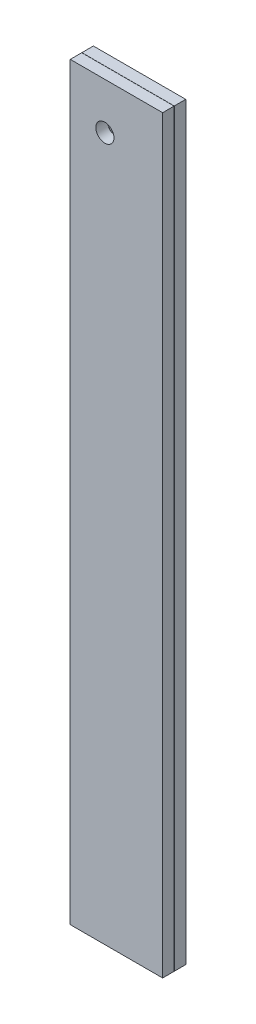
ISO-10303-21;
HEADER;
FILE_DESCRIPTION(('STEP AP214'),'2;1');
FILE_NAME('part.step','',(''),(''),'','','');
FILE_SCHEMA(('AUTOMOTIVE_DESIGN { 1 0 10303 214 1 1 1 1 }'));
ENDSEC;
DATA;
#1=APPLICATION_CONTEXT('core data for automotive mechanical design processes');
#2=APPLICATION_PROTOCOL_DEFINITION('international standard','automotive_design',2000,#1);
#3=PRODUCT_CONTEXT('',#1,'mechanical');
#4=PRODUCT('Part','Part','',(#3));
#5=PRODUCT_RELATED_PRODUCT_CATEGORY('part','',(#4));
#6=PRODUCT_DEFINITION_FORMATION('','',#4);
#7=PRODUCT_DEFINITION_CONTEXT('part definition',#1,'design');
#8=PRODUCT_DEFINITION('design','',#6,#7);
#9=PRODUCT_DEFINITION_SHAPE('','',#8);
#10=(LENGTH_UNIT() NAMED_UNIT(*) SI_UNIT(.MILLI.,.METRE.));
#11=(NAMED_UNIT(*) PLANE_ANGLE_UNIT() SI_UNIT($,.RADIAN.));
#12=(NAMED_UNIT(*) SI_UNIT($,.STERADIAN.) SOLID_ANGLE_UNIT());
#13=UNCERTAINTY_MEASURE_WITH_UNIT(LENGTH_MEASURE(1.E-05),#10,'distance_accuracy_value','');
#14=(GEOMETRIC_REPRESENTATION_CONTEXT(3) GLOBAL_UNCERTAINTY_ASSIGNED_CONTEXT((#13)) GLOBAL_UNIT_ASSIGNED_CONTEXT((#10,
#11,#12)) REPRESENTATION_CONTEXT('',''));
#15=CARTESIAN_POINT('',(0.,0.,0.));
#16=DIRECTION('',(0.,0.,1.));
#17=DIRECTION('',(1.,0.,0.));
#18=AXIS2_PLACEMENT_3D('',#15,#16,#17);
#19=CARTESIAN_POINT('',(0.,0.,6.41));
#20=DIRECTION('',(0.,0.,1.));
#21=DIRECTION('',(0.,-1.,0.));
#22=AXIS2_PLACEMENT_3D('',#19,#20,#21);
#23=PLANE('',#22);
#24=CARTESIAN_POINT('',(19.0400000000212,-25.3999999999761,6.41));
#25=DIRECTION('',(0.,0.,1.));
#26=DIRECTION('',(0.,-1.,0.));
#27=AXIS2_PLACEMENT_3D('',#24,#25,#26);
#28=CIRCLE('',#27,5.);
#29=CARTESIAN_POINT('',(19.0400000000212,-30.3999999999761,6.40999999999999));
#30=VERTEX_POINT('',#29);
#31=EDGE_CURVE('E111',#30,#30,#28,.T.);
#32=ORIENTED_EDGE('',*,*,#31,.T.);
#33=EDGE_LOOP('',(#32));
#34=FACE_BOUND('',#33,.T.);
#35=DIRECTION('',(0.,-1.,0.));
#36=VECTOR('',#35,1.);
#37=CARTESIAN_POINT('',(50.7999999999999,0.,6.41));
#38=LINE('',#37,#36);
#39=CARTESIAN_POINT('',(50.7999999999999,0.,6.41));
#40=VERTEX_POINT('',#39);
#41=CARTESIAN_POINT('',(50.8,-412.09566061,6.40999999999995));
#42=VERTEX_POINT('',#41);
#43=EDGE_CURVE('E108',#40,#42,#38,.T.);
#44=ORIENTED_EDGE('',*,*,#43,.T.);
#45=DIRECTION('',(1.,0.,0.));
#46=VECTOR('',#45,1.);
#47=CARTESIAN_POINT('',(0.,-412.09566061,6.40999999999995));
#48=LINE('',#47,#46);
#49=CARTESIAN_POINT('',(0.,-412.09566061,6.40999999999995));
#50=VERTEX_POINT('',#49);
#51=EDGE_CURVE('E12',#50,#42,#48,.T.);
#52=ORIENTED_EDGE('',*,*,#51,.F.);
#53=DIRECTION('',(0.,-1.,0.));
#54=VECTOR('',#53,1.);
#55=CARTESIAN_POINT('',(0.,0.,6.41));
#56=LINE('',#55,#54);
#57=CARTESIAN_POINT('',(0.,0.,6.41));
#58=VERTEX_POINT('',#57);
#59=EDGE_CURVE('E62',#58,#50,#56,.T.);
#60=ORIENTED_EDGE('',*,*,#59,.F.);
#61=DIRECTION('',(1.,0.,0.));
#62=VECTOR('',#61,1.);
#63=CARTESIAN_POINT('',(0.,0.,6.41));
#64=LINE('',#63,#62);
#65=EDGE_CURVE('E47',#58,#40,#64,.T.);
#66=ORIENTED_EDGE('',*,*,#65,.T.);
#67=EDGE_LOOP('',(#44,#52,#60,#66));
#68=FACE_BOUND('',#67,.T.);
#69=ADVANCED_FACE('F44',(#34,#68),#23,.F.);
#70=CARTESIAN_POINT('',(0.,-412.09566061,0.));
#71=DIRECTION('',(0.,-1.,0.));
#72=DIRECTION('',(1.,0.,0.));
#73=AXIS2_PLACEMENT_3D('',#70,#71,#72);
#74=PLANE('',#73);
#75=DIRECTION('',(0.,0.,-1.));
#76=VECTOR('',#75,1.);
#77=CARTESIAN_POINT('',(50.8,-412.09566061,0.));
#78=LINE('',#77,#76);
#79=CARTESIAN_POINT('',(50.8,-412.09566061,12.7199999999999));
#80=VERTEX_POINT('',#79);
#81=EDGE_CURVE('E103',#80,#42,#78,.T.);
#82=ORIENTED_EDGE('',*,*,#81,.F.);
#83=DIRECTION('',(1.,0.,0.));
#84=VECTOR('',#83,1.);
#85=CARTESIAN_POINT('',(0.,-412.09566061,12.7199999999999));
#86=LINE('',#85,#84);
#87=CARTESIAN_POINT('',(0.,-412.09566061,12.7199999999999));
#88=VERTEX_POINT('',#87);
#89=EDGE_CURVE('E53',#88,#80,#86,.T.);
#90=ORIENTED_EDGE('',*,*,#89,.F.);
#91=DIRECTION('',(0.,0.,-1.));
#92=VECTOR('',#91,1.);
#93=CARTESIAN_POINT('',(0.,-412.09566061,0.));
#94=LINE('',#93,#92);
#95=EDGE_CURVE('E99',#88,#50,#94,.T.);
#96=ORIENTED_EDGE('',*,*,#95,.T.);
#97=ORIENTED_EDGE('',*,*,#51,.T.);
#98=EDGE_LOOP('',(#82,#90,#96,#97));
#99=FACE_BOUND('',#98,.T.);
#100=ADVANCED_FACE('F119',(#99),#74,.T.);
#101=CARTESIAN_POINT('',(0.,0.,12.72));
#102=DIRECTION('',(0.,0.,1.));
#103=DIRECTION('',(0.,-1.,0.));
#104=AXIS2_PLACEMENT_3D('',#101,#102,#103);
#105=PLANE('',#104);
#106=CARTESIAN_POINT('',(19.0400000000212,-25.3999999999761,12.72));
#107=DIRECTION('',(0.,0.,1.));
#108=DIRECTION('',(1.,0.,0.));
#109=AXIS2_PLACEMENT_3D('',#106,#107,#108);
#110=CIRCLE('',#109,5.);
#111=CARTESIAN_POINT('',(24.0400000000212,-25.3999999999761,12.72));
#112=VERTEX_POINT('',#111);
#113=EDGE_CURVE('E147',#112,#112,#110,.T.);
#114=ORIENTED_EDGE('',*,*,#113,.F.);
#115=EDGE_LOOP('',(#114));
#116=FACE_BOUND('',#115,.T.);
#117=DIRECTION('',(0.,-1.,0.));
#118=VECTOR('',#117,1.);
#119=CARTESIAN_POINT('',(50.7999999999999,0.,12.72));
#120=LINE('',#119,#118);
#121=CARTESIAN_POINT('',(50.7999999999999,0.,12.72));
#122=VERTEX_POINT('',#121);
#123=EDGE_CURVE('E95',#122,#80,#120,.T.);
#124=ORIENTED_EDGE('',*,*,#123,.F.);
#125=DIRECTION('',(1.,0.,0.));
#126=VECTOR('',#125,1.);
#127=CARTESIAN_POINT('',(0.,0.,12.72));
#128=LINE('',#127,#126);
#129=CARTESIAN_POINT('',(0.,0.,12.72));
#130=VERTEX_POINT('',#129);
#131=EDGE_CURVE('E91',#130,#122,#128,.T.);
#132=ORIENTED_EDGE('',*,*,#131,.F.);
#133=DIRECTION('',(0.,-1.,0.));
#134=VECTOR('',#133,1.);
#135=CARTESIAN_POINT('',(0.,0.,12.72));
#136=LINE('',#135,#134);
#137=EDGE_CURVE('E94',#130,#88,#136,.T.);
#138=ORIENTED_EDGE('',*,*,#137,.T.);
#139=ORIENTED_EDGE('',*,*,#89,.T.);
#140=EDGE_LOOP('',(#124,#132,#138,#139));
#141=FACE_BOUND('',#140,.T.);
#142=ADVANCED_FACE('F93',(#116,#141),#105,.T.);
#143=CARTESIAN_POINT('',(0.,0.,0.));
#144=DIRECTION('',(0.,1.,0.));
#145=DIRECTION('',(-1.,0.,0.));
#146=AXIS2_PLACEMENT_3D('',#143,#144,#145);
#147=PLANE('',#146);
#148=DIRECTION('',(0.,0.,1.));
#149=VECTOR('',#148,1.);
#150=CARTESIAN_POINT('',(50.7999999999999,0.,0.));
#151=LINE('',#150,#149);
#152=EDGE_CURVE('E110',#40,#122,#151,.T.);
#153=ORIENTED_EDGE('',*,*,#152,.F.);
#154=ORIENTED_EDGE('',*,*,#65,.F.);
#155=DIRECTION('',(0.,0.,1.));
#156=VECTOR('',#155,1.);
#157=CARTESIAN_POINT('',(0.,0.,0.));
#158=LINE('',#157,#156);
#159=EDGE_CURVE('E98',#58,#130,#158,.T.);
#160=ORIENTED_EDGE('',*,*,#159,.T.);
#161=ORIENTED_EDGE('',*,*,#131,.T.);
#162=EDGE_LOOP('',(#153,#154,#160,#161));
#163=FACE_BOUND('',#162,.T.);
#164=ADVANCED_FACE('F101',(#163),#147,.T.);
#165=CARTESIAN_POINT('',(0.,0.,0.));
#166=DIRECTION('',(1.,0.,0.));
#167=DIRECTION('',(0.,1.,0.));
#168=AXIS2_PLACEMENT_3D('',#165,#166,#167);
#169=PLANE('',#168);
#170=ORIENTED_EDGE('',*,*,#59,.T.);
#171=ORIENTED_EDGE('',*,*,#95,.F.);
#172=ORIENTED_EDGE('',*,*,#137,.F.);
#173=ORIENTED_EDGE('',*,*,#159,.F.);
#174=EDGE_LOOP('',(#170,#171,#172,#173));
#175=FACE_BOUND('',#174,.T.);
#176=ADVANCED_FACE('F97',(#175),#169,.F.);
#177=CARTESIAN_POINT('',(50.7999999999999,0.,0.));
#178=DIRECTION('',(1.,0.,0.));
#179=DIRECTION('',(0.,1.,0.));
#180=AXIS2_PLACEMENT_3D('',#177,#178,#179);
#181=PLANE('',#180);
#182=ORIENTED_EDGE('',*,*,#43,.F.);
#183=ORIENTED_EDGE('',*,*,#152,.T.);
#184=ORIENTED_EDGE('',*,*,#123,.T.);
#185=ORIENTED_EDGE('',*,*,#81,.T.);
#186=EDGE_LOOP('',(#182,#183,#184,#185));
#187=FACE_BOUND('',#186,.T.);
#188=ADVANCED_FACE('F118',(#187),#181,.T.);
#189=CARTESIAN_POINT('',(19.0400000000212,-25.3999999999761,-18.28));
#190=DIRECTION('',(0.,0.,1.));
#191=DIRECTION('',(1.,0.,0.));
#192=AXIS2_PLACEMENT_3D('',#189,#190,#191);
#193=CYLINDRICAL_SURFACE('',#192,5.);
#194=ORIENTED_EDGE('',*,*,#113,.T.);
#195=EDGE_LOOP('',(#194));
#196=FACE_BOUND('',#195,.T.);
#197=ORIENTED_EDGE('',*,*,#31,.F.);
#198=EDGE_LOOP('',(#197));
#199=FACE_BOUND('',#198,.T.);
#200=ADVANCED_FACE('F138',(#196,#199),#193,.F.);
#201=CLOSED_SHELL('',(#69,#100,#142,#164,#176,#188,#200));
#202=MANIFOLD_SOLID_BREP('B2',#201);
#203=CARTESIAN_POINT('',(0.,-412.09566061,6.31));
#204=DIRECTION('',(1.,0.,0.));
#205=DIRECTION('',(0.,0.,-1.));
#206=AXIS2_PLACEMENT_3D('',#203,#204,#205);
#207=PLANE('',#206);
#208=DIRECTION('',(0.,-1.,0.));
#209=VECTOR('',#208,1.);
#210=CARTESIAN_POINT('',(0.,-412.09566061,0.));
#211=LINE('',#210,#209);
#212=CARTESIAN_POINT('',(0.,0.,0.));
#213=VERTEX_POINT('',#212);
#214=CARTESIAN_POINT('',(0.,-412.09566061,0.));
#215=VERTEX_POINT('',#214);
#216=EDGE_CURVE('E253',#213,#215,#211,.T.);
#217=ORIENTED_EDGE('',*,*,#216,.T.);
#218=DIRECTION('',(0.,0.,-1.));
#219=VECTOR('',#218,1.);
#220=CARTESIAN_POINT('',(0.,-412.09566061,6.31));
#221=LINE('',#220,#219);
#222=CARTESIAN_POINT('',(0.,-412.09566061,6.31));
#223=VERTEX_POINT('',#222);
#224=EDGE_CURVE('E42',#223,#215,#221,.T.);
#225=ORIENTED_EDGE('',*,*,#224,.F.);
#226=DIRECTION('',(0.,-1.,0.));
#227=VECTOR('',#226,1.);
#228=CARTESIAN_POINT('',(0.,-412.09566061,6.31));
#229=LINE('',#228,#227);
#230=CARTESIAN_POINT('',(0.,0.,6.31));
#231=VERTEX_POINT('',#230);
#232=EDGE_CURVE('E239',#231,#223,#229,.T.);
#233=ORIENTED_EDGE('',*,*,#232,.F.);
#234=DIRECTION('',(0.,0.,-1.));
#235=VECTOR('',#234,1.);
#236=CARTESIAN_POINT('',(0.,0.,6.31));
#237=LINE('',#236,#235);
#238=EDGE_CURVE('E249',#231,#213,#237,.T.);
#239=ORIENTED_EDGE('',*,*,#238,.T.);
#240=EDGE_LOOP('',(#217,#225,#233,#239));
#241=FACE_BOUND('',#240,.T.);
#242=ADVANCED_FACE('F188',(#241),#207,.F.);
#243=CARTESIAN_POINT('',(50.8,-412.09566061,6.31));
#244=DIRECTION('',(0.,1.,0.));
#245=DIRECTION('',(0.,0.,1.));
#246=AXIS2_PLACEMENT_3D('',#243,#244,#245);
#247=PLANE('',#246);
#248=DIRECTION('',(1.,0.,0.));
#249=VECTOR('',#248,1.);
#250=CARTESIAN_POINT('',(50.8,-412.09566061,0.));
#251=LINE('',#250,#249);
#252=CARTESIAN_POINT('',(50.8,-412.09566061,0.));
#253=VERTEX_POINT('',#252);
#254=EDGE_CURVE('E244',#215,#253,#251,.T.);
#255=ORIENTED_EDGE('',*,*,#254,.T.);
#256=DIRECTION('',(0.,0.,-1.));
#257=VECTOR('',#256,1.);
#258=CARTESIAN_POINT('',(50.8,-412.09566061,6.31));
#259=LINE('',#258,#257);
#260=CARTESIAN_POINT('',(50.8,-412.09566061,6.31));
#261=VERTEX_POINT('',#260);
#262=EDGE_CURVE('E197',#261,#253,#259,.T.);
#263=ORIENTED_EDGE('',*,*,#262,.F.);
#264=DIRECTION('',(1.,0.,0.));
#265=VECTOR('',#264,1.);
#266=CARTESIAN_POINT('',(50.8,-412.09566061,6.31));
#267=LINE('',#266,#265);
#268=EDGE_CURVE('E234',#223,#261,#267,.T.);
#269=ORIENTED_EDGE('',*,*,#268,.F.);
#270=ORIENTED_EDGE('',*,*,#224,.T.);
#271=EDGE_LOOP('',(#255,#263,#269,#270));
#272=FACE_BOUND('',#271,.T.);
#273=ADVANCED_FACE('F243',(#272),#247,.F.);
#274=CARTESIAN_POINT('',(50.7999999999999,0.,6.31));
#275=DIRECTION('',(-1.,0.,0.));
#276=DIRECTION('',(0.,-1.,0.));
#277=AXIS2_PLACEMENT_3D('',#274,#275,#276);
#278=PLANE('',#277);
#279=DIRECTION('',(0.,1.,0.));
#280=VECTOR('',#279,1.);
#281=CARTESIAN_POINT('',(50.7999999999999,0.,0.));
#282=LINE('',#281,#280);
#283=CARTESIAN_POINT('',(50.7999999999999,0.,0.));
#284=VERTEX_POINT('',#283);
#285=EDGE_CURVE('E221',#253,#284,#282,.T.);
#286=ORIENTED_EDGE('',*,*,#285,.T.);
#287=DIRECTION('',(0.,0.,-1.));
#288=VECTOR('',#287,1.);
#289=CARTESIAN_POINT('',(50.7999999999999,0.,6.31));
#290=LINE('',#289,#288);
#291=CARTESIAN_POINT('',(50.7999999999999,0.,6.31));
#292=VERTEX_POINT('',#291);
#293=EDGE_CURVE('E245',#292,#284,#290,.T.);
#294=ORIENTED_EDGE('',*,*,#293,.F.);
#295=DIRECTION('',(0.,1.,0.));
#296=VECTOR('',#295,1.);
#297=CARTESIAN_POINT('',(50.8,-361.29566061,6.31));
#298=LINE('',#297,#296);
#299=EDGE_CURVE('E237',#261,#292,#298,.T.);
#300=ORIENTED_EDGE('',*,*,#299,.F.);
#301=ORIENTED_EDGE('',*,*,#262,.T.);
#302=EDGE_LOOP('',(#286,#294,#300,#301));
#303=FACE_BOUND('',#302,.T.);
#304=ADVANCED_FACE('F247',(#303),#278,.F.);
#305=CARTESIAN_POINT('',(0.,0.,6.31));
#306=DIRECTION('',(0.,-1.,0.));
#307=DIRECTION('',(0.,0.,-1.));
#308=AXIS2_PLACEMENT_3D('',#305,#306,#307);
#309=PLANE('',#308);
#310=DIRECTION('',(-1.,0.,0.));
#311=VECTOR('',#310,1.);
#312=CARTESIAN_POINT('',(0.,0.,0.));
#313=LINE('',#312,#311);
#314=EDGE_CURVE('E227',#284,#213,#313,.T.);
#315=ORIENTED_EDGE('',*,*,#314,.T.);
#316=ORIENTED_EDGE('',*,*,#238,.F.);
#317=DIRECTION('',(-1.,0.,0.));
#318=VECTOR('',#317,1.);
#319=CARTESIAN_POINT('',(0.,0.,6.31));
#320=LINE('',#319,#318);
#321=EDGE_CURVE('E205',#292,#231,#320,.T.);
#322=ORIENTED_EDGE('',*,*,#321,.F.);
#323=ORIENTED_EDGE('',*,*,#293,.T.);
#324=EDGE_LOOP('',(#315,#316,#322,#323));
#325=FACE_BOUND('',#324,.T.);
#326=ADVANCED_FACE('F261',(#325),#309,.F.);
#327=CARTESIAN_POINT('',(0.,0.,6.31));
#328=DIRECTION('',(0.,0.,-1.));
#329=DIRECTION('',(-1.,0.,0.));
#330=AXIS2_PLACEMENT_3D('',#327,#328,#329);
#331=PLANE('',#330);
#332=CARTESIAN_POINT('',(19.0400000000212,-25.3999999999761,6.31));
#333=DIRECTION('',(0.,0.,-1.));
#334=DIRECTION('',(-1.,0.,0.));
#335=AXIS2_PLACEMENT_3D('',#332,#333,#334);
#336=CIRCLE('',#335,5.);
#337=CARTESIAN_POINT('',(14.0400000000212,-25.3999999999761,6.31));
#338=VERTEX_POINT('',#337);
#339=EDGE_CURVE('E256',#338,#338,#336,.T.);
#340=ORIENTED_EDGE('',*,*,#339,.T.);
#341=EDGE_LOOP('',(#340));
#342=FACE_BOUND('',#341,.T.);
#343=ORIENTED_EDGE('',*,*,#232,.T.);
#344=ORIENTED_EDGE('',*,*,#268,.T.);
#345=ORIENTED_EDGE('',*,*,#299,.T.);
#346=ORIENTED_EDGE('',*,*,#321,.T.);
#347=EDGE_LOOP('',(#343,#344,#345,#346));
#348=FACE_BOUND('',#347,.T.);
#349=ADVANCED_FACE('F235',(#342,#348),#331,.F.);
#350=CARTESIAN_POINT('',(0.,0.,0.));
#351=DIRECTION('',(0.,0.,-1.));
#352=DIRECTION('',(-1.,0.,0.));
#353=AXIS2_PLACEMENT_3D('',#350,#351,#352);
#354=PLANE('',#353);
#355=CARTESIAN_POINT('',(19.0400000000212,-25.3999999999761,0.));
#356=DIRECTION('',(0.,0.,-1.));
#357=DIRECTION('',(-1.,0.,0.));
#358=AXIS2_PLACEMENT_3D('',#355,#356,#357);
#359=CIRCLE('',#358,5.);
#360=CARTESIAN_POINT('',(14.0400000000212,-25.3999999999761,0.));
#361=VERTEX_POINT('',#360);
#362=EDGE_CURVE('E191',#361,#361,#359,.T.);
#363=ORIENTED_EDGE('',*,*,#362,.F.);
#364=EDGE_LOOP('',(#363));
#365=FACE_BOUND('',#364,.T.);
#366=ORIENTED_EDGE('',*,*,#216,.F.);
#367=ORIENTED_EDGE('',*,*,#314,.F.);
#368=ORIENTED_EDGE('',*,*,#285,.F.);
#369=ORIENTED_EDGE('',*,*,#254,.F.);
#370=EDGE_LOOP('',(#366,#367,#368,#369));
#371=FACE_BOUND('',#370,.T.);
#372=ADVANCED_FACE('F264',(#365,#371),#354,.T.);
#373=CARTESIAN_POINT('',(19.0400000000212,-25.3999999999761,-18.28));
#374=DIRECTION('',(0.,0.,1.));
#375=DIRECTION('',(1.,0.,0.));
#376=AXIS2_PLACEMENT_3D('',#373,#374,#375);
#377=CYLINDRICAL_SURFACE('',#376,5.);
#378=ORIENTED_EDGE('',*,*,#362,.T.);
#379=EDGE_LOOP('',(#378));
#380=FACE_BOUND('',#379,.T.);
#381=ORIENTED_EDGE('',*,*,#339,.F.);
#382=EDGE_LOOP('',(#381));
#383=FACE_BOUND('',#382,.T.);
#384=ADVANCED_FACE('F273',(#380,#383),#377,.F.);
#385=CLOSED_SHELL('',(#242,#273,#304,#326,#349,#372,#384));
#386=MANIFOLD_SOLID_BREP('B6',#385);
#387=ADVANCED_BREP_SHAPE_REPRESENTATION('',(#18,#202,#386),#14);
#388=SHAPE_DEFINITION_REPRESENTATION(#9,#387);
ENDSEC;
END-ISO-10303-21;
